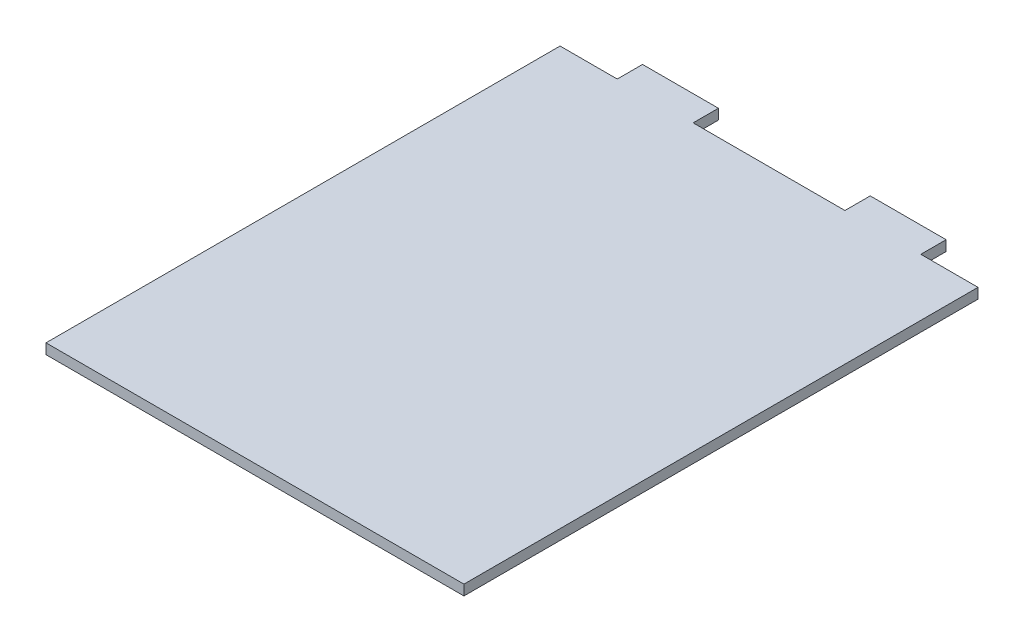
ISO-10303-21;
HEADER;
FILE_DESCRIPTION(('STEP AP214'),'2;1');
FILE_NAME('part.step','',(''),(''),'','','');
FILE_SCHEMA(('AUTOMOTIVE_DESIGN { 1 0 10303 214 1 1 1 1 }'));
ENDSEC;
DATA;
#1=APPLICATION_CONTEXT('core data for automotive mechanical design processes');
#2=APPLICATION_PROTOCOL_DEFINITION('international standard','automotive_design',2000,#1);
#3=PRODUCT_CONTEXT('',#1,'mechanical');
#4=PRODUCT('Part','Part','',(#3));
#5=PRODUCT_RELATED_PRODUCT_CATEGORY('part','',(#4));
#6=PRODUCT_DEFINITION_FORMATION('','',#4);
#7=PRODUCT_DEFINITION_CONTEXT('part definition',#1,'design');
#8=PRODUCT_DEFINITION('design','',#6,#7);
#9=PRODUCT_DEFINITION_SHAPE('','',#8);
#10=(LENGTH_UNIT() NAMED_UNIT(*) SI_UNIT(.MILLI.,.METRE.));
#11=(NAMED_UNIT(*) PLANE_ANGLE_UNIT() SI_UNIT($,.RADIAN.));
#12=(NAMED_UNIT(*) SI_UNIT($,.STERADIAN.) SOLID_ANGLE_UNIT());
#13=UNCERTAINTY_MEASURE_WITH_UNIT(LENGTH_MEASURE(1.E-05),#10,'distance_accuracy_value','');
#14=(GEOMETRIC_REPRESENTATION_CONTEXT(3) GLOBAL_UNCERTAINTY_ASSIGNED_CONTEXT((#13)) GLOBAL_UNIT_ASSIGNED_CONTEXT((#10,
#11,#12)) REPRESENTATION_CONTEXT('',''));
#15=CARTESIAN_POINT('',(0.,0.,0.));
#16=DIRECTION('',(0.,0.,1.));
#17=DIRECTION('',(1.,0.,0.));
#18=AXIS2_PLACEMENT_3D('',#15,#16,#17);
#19=CARTESIAN_POINT('',(150.,10.16,-254.));
#20=DIRECTION('',(0.,0.,1.));
#21=DIRECTION('',(1.,0.,0.));
#22=AXIS2_PLACEMENT_3D('',#19,#20,#21);
#23=PLANE('',#22);
#24=DIRECTION('',(-1.,0.,0.));
#25=VECTOR('',#24,1.);
#26=CARTESIAN_POINT('',(150.,0.,-254.));
#27=LINE('',#26,#25);
#28=CARTESIAN_POINT('',(206.5,0.,-254.));
#29=VERTEX_POINT('',#28);
#30=CARTESIAN_POINT('',(150.,0.,-254.));
#31=VERTEX_POINT('',#30);
#32=EDGE_CURVE('E157',#29,#31,#27,.T.);
#33=ORIENTED_EDGE('',*,*,#32,.T.);
#34=DIRECTION('',(0.,-1.,0.));
#35=VECTOR('',#34,1.);
#36=CARTESIAN_POINT('',(150.,10.16,-254.));
#37=LINE('',#36,#35);
#38=CARTESIAN_POINT('',(150.,10.16,-254.));
#39=VERTEX_POINT('',#38);
#40=EDGE_CURVE('E11',#39,#31,#37,.T.);
#41=ORIENTED_EDGE('',*,*,#40,.F.);
#42=DIRECTION('',(-1.,0.,0.));
#43=VECTOR('',#42,1.);
#44=CARTESIAN_POINT('',(150.,10.16,-254.));
#45=LINE('',#44,#43);
#46=CARTESIAN_POINT('',(206.5,10.16,-254.));
#47=VERTEX_POINT('',#46);
#48=EDGE_CURVE('E179',#47,#39,#45,.T.);
#49=ORIENTED_EDGE('',*,*,#48,.F.);
#50=DIRECTION('',(0.,-1.,0.));
#51=VECTOR('',#50,1.);
#52=CARTESIAN_POINT('',(206.5,10.16,-254.));
#53=LINE('',#52,#51);
#54=EDGE_CURVE('E153',#47,#29,#53,.T.);
#55=ORIENTED_EDGE('',*,*,#54,.T.);
#56=EDGE_LOOP('',(#33,#41,#49,#55));
#57=FACE_BOUND('',#56,.T.);
#58=ADVANCED_FACE('F37',(#57),#23,.F.);
#59=CARTESIAN_POINT('',(150.,10.16,-254.));
#60=DIRECTION('',(-1.,0.,0.));
#61=DIRECTION('',(0.,0.,1.));
#62=AXIS2_PLACEMENT_3D('',#59,#60,#61);
#63=PLANE('',#62);
#64=DIRECTION('',(0.,0.,-1.));
#65=VECTOR('',#64,1.);
#66=CARTESIAN_POINT('',(150.,0.,-254.));
#67=LINE('',#66,#65);
#68=CARTESIAN_POINT('',(150.,0.,-279.));
#69=VERTEX_POINT('',#68);
#70=EDGE_CURVE('E160',#31,#69,#67,.T.);
#71=ORIENTED_EDGE('',*,*,#70,.T.);
#72=DIRECTION('',(0.,-1.,0.));
#73=VECTOR('',#72,1.);
#74=CARTESIAN_POINT('',(150.,10.16,-279.));
#75=LINE('',#74,#73);
#76=CARTESIAN_POINT('',(150.,10.16,-279.));
#77=VERTEX_POINT('',#76);
#78=EDGE_CURVE('E45',#77,#69,#75,.T.);
#79=ORIENTED_EDGE('',*,*,#78,.F.);
#80=DIRECTION('',(0.,0.,-1.));
#81=VECTOR('',#80,1.);
#82=CARTESIAN_POINT('',(150.,10.16,-254.));
#83=LINE('',#82,#81);
#84=EDGE_CURVE('E108',#39,#77,#83,.T.);
#85=ORIENTED_EDGE('',*,*,#84,.F.);
#86=ORIENTED_EDGE('',*,*,#40,.T.);
#87=EDGE_LOOP('',(#71,#79,#85,#86));
#88=FACE_BOUND('',#87,.T.);
#89=ADVANCED_FACE('F257',(#88),#63,.F.);
#90=CARTESIAN_POINT('',(150.,10.16,-279.));
#91=DIRECTION('',(0.,0.,1.));
#92=DIRECTION('',(1.,0.,0.));
#93=AXIS2_PLACEMENT_3D('',#90,#91,#92);
#94=PLANE('',#93);
#95=DIRECTION('',(-1.,0.,0.));
#96=VECTOR('',#95,1.);
#97=CARTESIAN_POINT('',(150.,0.,-279.));
#98=LINE('',#97,#96);
#99=CARTESIAN_POINT('',(75.,0.,-279.));
#100=VERTEX_POINT('',#99);
#101=EDGE_CURVE('E162',#69,#100,#98,.T.);
#102=ORIENTED_EDGE('',*,*,#101,.T.);
#103=DIRECTION('',(0.,-1.,0.));
#104=VECTOR('',#103,1.);
#105=CARTESIAN_POINT('',(75.,10.16,-279.));
#106=LINE('',#105,#104);
#107=CARTESIAN_POINT('',(75.,10.16,-279.));
#108=VERTEX_POINT('',#107);
#109=EDGE_CURVE('E198',#108,#100,#106,.T.);
#110=ORIENTED_EDGE('',*,*,#109,.F.);
#111=DIRECTION('',(-1.,0.,0.));
#112=VECTOR('',#111,1.);
#113=CARTESIAN_POINT('',(150.,10.16,-279.));
#114=LINE('',#113,#112);
#115=EDGE_CURVE('E206',#77,#108,#114,.T.);
#116=ORIENTED_EDGE('',*,*,#115,.F.);
#117=ORIENTED_EDGE('',*,*,#78,.T.);
#118=EDGE_LOOP('',(#102,#110,#116,#117));
#119=FACE_BOUND('',#118,.T.);
#120=ADVANCED_FACE('F204',(#119),#94,.F.);
#121=CARTESIAN_POINT('',(75.,10.16,-279.));
#122=DIRECTION('',(1.,0.,0.));
#123=DIRECTION('',(0.,0.,-1.));
#124=AXIS2_PLACEMENT_3D('',#121,#122,#123);
#125=PLANE('',#124);
#126=DIRECTION('',(0.,0.,1.));
#127=VECTOR('',#126,1.);
#128=CARTESIAN_POINT('',(75.,0.,-279.));
#129=LINE('',#128,#127);
#130=CARTESIAN_POINT('',(75.,0.,-254.));
#131=VERTEX_POINT('',#130);
#132=EDGE_CURVE('E164',#100,#131,#129,.T.);
#133=ORIENTED_EDGE('',*,*,#132,.T.);
#134=DIRECTION('',(0.,-1.,0.));
#135=VECTOR('',#134,1.);
#136=CARTESIAN_POINT('',(75.,10.16,-254.));
#137=LINE('',#136,#135);
#138=CARTESIAN_POINT('',(75.,10.16,-254.));
#139=VERTEX_POINT('',#138);
#140=EDGE_CURVE('E195',#139,#131,#137,.T.);
#141=ORIENTED_EDGE('',*,*,#140,.F.);
#142=DIRECTION('',(0.,0.,1.));
#143=VECTOR('',#142,1.);
#144=CARTESIAN_POINT('',(75.,10.16,-279.));
#145=LINE('',#144,#143);
#146=EDGE_CURVE('E224',#108,#139,#145,.T.);
#147=ORIENTED_EDGE('',*,*,#146,.F.);
#148=ORIENTED_EDGE('',*,*,#109,.T.);
#149=EDGE_LOOP('',(#133,#141,#147,#148));
#150=FACE_BOUND('',#149,.T.);
#151=ADVANCED_FACE('F215',(#150),#125,.F.);
#152=CARTESIAN_POINT('',(-75.,10.16,-254.));
#153=DIRECTION('',(0.,0.,1.));
#154=DIRECTION('',(1.,0.,0.));
#155=AXIS2_PLACEMENT_3D('',#152,#153,#154);
#156=PLANE('',#155);
#157=DIRECTION('',(-1.,0.,0.));
#158=VECTOR('',#157,1.);
#159=CARTESIAN_POINT('',(-75.,0.,-254.));
#160=LINE('',#159,#158);
#161=CARTESIAN_POINT('',(-75.,0.,-254.));
#162=VERTEX_POINT('',#161);
#163=EDGE_CURVE('E166',#131,#162,#160,.T.);
#164=ORIENTED_EDGE('',*,*,#163,.T.);
#165=DIRECTION('',(0.,-1.,0.));
#166=VECTOR('',#165,1.);
#167=CARTESIAN_POINT('',(-75.,10.16,-254.));
#168=LINE('',#167,#166);
#169=CARTESIAN_POINT('',(-75.,10.16,-254.));
#170=VERTEX_POINT('',#169);
#171=EDGE_CURVE('E192',#170,#162,#168,.T.);
#172=ORIENTED_EDGE('',*,*,#171,.F.);
#173=DIRECTION('',(-1.,0.,0.));
#174=VECTOR('',#173,1.);
#175=CARTESIAN_POINT('',(-75.,10.16,-254.));
#176=LINE('',#175,#174);
#177=EDGE_CURVE('E221',#139,#170,#176,.T.);
#178=ORIENTED_EDGE('',*,*,#177,.F.);
#179=ORIENTED_EDGE('',*,*,#140,.T.);
#180=EDGE_LOOP('',(#164,#172,#178,#179));
#181=FACE_BOUND('',#180,.T.);
#182=ADVANCED_FACE('F219',(#181),#156,.F.);
#183=CARTESIAN_POINT('',(-75.0000000000001,10.16,-279.));
#184=DIRECTION('',(-1.,0.,0.));
#185=DIRECTION('',(0.,0.,1.));
#186=AXIS2_PLACEMENT_3D('',#183,#184,#185);
#187=PLANE('',#186);
#188=DIRECTION('',(0.,0.,-1.));
#189=VECTOR('',#188,1.);
#190=CARTESIAN_POINT('',(-75.0000000000001,0.,-279.));
#191=LINE('',#190,#189);
#192=CARTESIAN_POINT('',(-75.0000000000001,0.,-279.));
#193=VERTEX_POINT('',#192);
#194=EDGE_CURVE('E168',#162,#193,#191,.T.);
#195=ORIENTED_EDGE('',*,*,#194,.T.);
#196=DIRECTION('',(0.,-1.,0.));
#197=VECTOR('',#196,1.);
#198=CARTESIAN_POINT('',(-75.0000000000001,10.16,-279.));
#199=LINE('',#198,#197);
#200=CARTESIAN_POINT('',(-75.0000000000001,10.16,-279.));
#201=VERTEX_POINT('',#200);
#202=EDGE_CURVE('E189',#201,#193,#199,.T.);
#203=ORIENTED_EDGE('',*,*,#202,.F.);
#204=DIRECTION('',(0.,0.,-1.));
#205=VECTOR('',#204,1.);
#206=CARTESIAN_POINT('',(-75.0000000000001,10.16,-279.));
#207=LINE('',#206,#205);
#208=EDGE_CURVE('E223',#170,#201,#207,.T.);
#209=ORIENTED_EDGE('',*,*,#208,.F.);
#210=ORIENTED_EDGE('',*,*,#171,.T.);
#211=EDGE_LOOP('',(#195,#203,#209,#210));
#212=FACE_BOUND('',#211,.T.);
#213=ADVANCED_FACE('F270',(#212),#187,.F.);
#214=CARTESIAN_POINT('',(-150.,10.16,-279.));
#215=DIRECTION('',(0.,0.,1.));
#216=DIRECTION('',(1.,0.,0.));
#217=AXIS2_PLACEMENT_3D('',#214,#215,#216);
#218=PLANE('',#217);
#219=DIRECTION('',(-1.,0.,0.));
#220=VECTOR('',#219,1.);
#221=CARTESIAN_POINT('',(-150.,0.,-279.));
#222=LINE('',#221,#220);
#223=CARTESIAN_POINT('',(-150.,0.,-279.));
#224=VERTEX_POINT('',#223);
#225=EDGE_CURVE('E170',#193,#224,#222,.T.);
#226=ORIENTED_EDGE('',*,*,#225,.T.);
#227=DIRECTION('',(0.,-1.,0.));
#228=VECTOR('',#227,1.);
#229=CARTESIAN_POINT('',(-150.,10.16,-279.));
#230=LINE('',#229,#228);
#231=CARTESIAN_POINT('',(-150.,10.16,-279.));
#232=VERTEX_POINT('',#231);
#233=EDGE_CURVE('E186',#232,#224,#230,.T.);
#234=ORIENTED_EDGE('',*,*,#233,.F.);
#235=DIRECTION('',(-1.,0.,0.));
#236=VECTOR('',#235,1.);
#237=CARTESIAN_POINT('',(-150.,10.16,-279.));
#238=LINE('',#237,#236);
#239=EDGE_CURVE('E226',#201,#232,#238,.T.);
#240=ORIENTED_EDGE('',*,*,#239,.F.);
#241=ORIENTED_EDGE('',*,*,#202,.T.);
#242=EDGE_LOOP('',(#226,#234,#240,#241));
#243=FACE_BOUND('',#242,.T.);
#244=ADVANCED_FACE('F273',(#243),#218,.F.);
#245=CARTESIAN_POINT('',(-150.,10.16,-254.));
#246=DIRECTION('',(1.,0.,0.));
#247=DIRECTION('',(0.,0.,-1.));
#248=AXIS2_PLACEMENT_3D('',#245,#246,#247);
#249=PLANE('',#248);
#250=DIRECTION('',(0.,0.,1.));
#251=VECTOR('',#250,1.);
#252=CARTESIAN_POINT('',(-150.,0.,-254.));
#253=LINE('',#252,#251);
#254=CARTESIAN_POINT('',(-150.,0.,-254.));
#255=VERTEX_POINT('',#254);
#256=EDGE_CURVE('E172',#224,#255,#253,.T.);
#257=ORIENTED_EDGE('',*,*,#256,.T.);
#258=DIRECTION('',(0.,-1.,0.));
#259=VECTOR('',#258,1.);
#260=CARTESIAN_POINT('',(-150.,10.16,-254.));
#261=LINE('',#260,#259);
#262=CARTESIAN_POINT('',(-150.,10.16,-254.));
#263=VERTEX_POINT('',#262);
#264=EDGE_CURVE('E183',#263,#255,#261,.T.);
#265=ORIENTED_EDGE('',*,*,#264,.F.);
#266=DIRECTION('',(0.,0.,1.));
#267=VECTOR('',#266,1.);
#268=CARTESIAN_POINT('',(-150.,10.16,-254.));
#269=LINE('',#268,#267);
#270=EDGE_CURVE('E232',#232,#263,#269,.T.);
#271=ORIENTED_EDGE('',*,*,#270,.F.);
#272=ORIENTED_EDGE('',*,*,#233,.T.);
#273=EDGE_LOOP('',(#257,#265,#271,#272));
#274=FACE_BOUND('',#273,.T.);
#275=ADVANCED_FACE('F238',(#274),#249,.F.);
#276=CARTESIAN_POINT('',(-206.5,10.16,-254.));
#277=DIRECTION('',(0.,0.,1.));
#278=DIRECTION('',(1.,0.,0.));
#279=AXIS2_PLACEMENT_3D('',#276,#277,#278);
#280=PLANE('',#279);
#281=DIRECTION('',(-1.,0.,0.));
#282=VECTOR('',#281,1.);
#283=CARTESIAN_POINT('',(-206.5,0.,-254.));
#284=LINE('',#283,#282);
#285=CARTESIAN_POINT('',(-206.5,0.,-254.));
#286=VERTEX_POINT('',#285);
#287=EDGE_CURVE('E174',#255,#286,#284,.T.);
#288=ORIENTED_EDGE('',*,*,#287,.T.);
#289=DIRECTION('',(0.,-1.,0.));
#290=VECTOR('',#289,1.);
#291=CARTESIAN_POINT('',(-206.5,10.16,-254.));
#292=LINE('',#291,#290);
#293=CARTESIAN_POINT('',(-206.5,10.16,-254.));
#294=VERTEX_POINT('',#293);
#295=EDGE_CURVE('E148',#294,#286,#292,.T.);
#296=ORIENTED_EDGE('',*,*,#295,.F.);
#297=DIRECTION('',(-1.,0.,0.));
#298=VECTOR('',#297,1.);
#299=CARTESIAN_POINT('',(-206.5,10.16,-254.));
#300=LINE('',#299,#298);
#301=EDGE_CURVE('E139',#263,#294,#300,.T.);
#302=ORIENTED_EDGE('',*,*,#301,.F.);
#303=ORIENTED_EDGE('',*,*,#264,.T.);
#304=EDGE_LOOP('',(#288,#296,#302,#303));
#305=FACE_BOUND('',#304,.T.);
#306=ADVANCED_FACE('F242',(#305),#280,.F.);
#307=CARTESIAN_POINT('',(-206.5,10.16,254.));
#308=DIRECTION('',(1.,0.,0.));
#309=DIRECTION('',(0.,0.,-1.));
#310=AXIS2_PLACEMENT_3D('',#307,#308,#309);
#311=PLANE('',#310);
#312=DIRECTION('',(0.,0.,1.));
#313=VECTOR('',#312,1.);
#314=CARTESIAN_POINT('',(-206.5,0.,254.));
#315=LINE('',#314,#313);
#316=CARTESIAN_POINT('',(-206.5,0.,254.));
#317=VERTEX_POINT('',#316);
#318=EDGE_CURVE('E147',#286,#317,#315,.T.);
#319=ORIENTED_EDGE('',*,*,#318,.T.);
#320=DIRECTION('',(0.,-1.,0.));
#321=VECTOR('',#320,1.);
#322=CARTESIAN_POINT('',(-206.5,10.16,254.));
#323=LINE('',#322,#321);
#324=CARTESIAN_POINT('',(-206.5,10.16,254.));
#325=VERTEX_POINT('',#324);
#326=EDGE_CURVE('E144',#325,#317,#323,.T.);
#327=ORIENTED_EDGE('',*,*,#326,.F.);
#328=DIRECTION('',(0.,0.,1.));
#329=VECTOR('',#328,1.);
#330=CARTESIAN_POINT('',(-206.5,10.16,254.));
#331=LINE('',#330,#329);
#332=EDGE_CURVE('E133',#294,#325,#331,.T.);
#333=ORIENTED_EDGE('',*,*,#332,.F.);
#334=ORIENTED_EDGE('',*,*,#295,.T.);
#335=EDGE_LOOP('',(#319,#327,#333,#334));
#336=FACE_BOUND('',#335,.T.);
#337=ADVANCED_FACE('F145',(#336),#311,.F.);
#338=CARTESIAN_POINT('',(-206.5,10.16,254.));
#339=DIRECTION('',(0.,0.,-1.));
#340=DIRECTION('',(-1.,0.,0.));
#341=AXIS2_PLACEMENT_3D('',#338,#339,#340);
#342=PLANE('',#341);
#343=DIRECTION('',(1.,0.,0.));
#344=VECTOR('',#343,1.);
#345=CARTESIAN_POINT('',(-206.5,0.,254.));
#346=LINE('',#345,#344);
#347=CARTESIAN_POINT('',(206.5,0.,254.));
#348=VERTEX_POINT('',#347);
#349=EDGE_CURVE('E94',#317,#348,#346,.T.);
#350=ORIENTED_EDGE('',*,*,#349,.T.);
#351=DIRECTION('',(0.,-1.,0.));
#352=VECTOR('',#351,1.);
#353=CARTESIAN_POINT('',(206.5,10.16,254.));
#354=LINE('',#353,#352);
#355=CARTESIAN_POINT('',(206.5,10.16,254.));
#356=VERTEX_POINT('',#355);
#357=EDGE_CURVE('E149',#356,#348,#354,.T.);
#358=ORIENTED_EDGE('',*,*,#357,.F.);
#359=DIRECTION('',(1.,0.,0.));
#360=VECTOR('',#359,1.);
#361=CARTESIAN_POINT('',(-206.5,10.16,254.));
#362=LINE('',#361,#360);
#363=EDGE_CURVE('E137',#325,#356,#362,.T.);
#364=ORIENTED_EDGE('',*,*,#363,.F.);
#365=ORIENTED_EDGE('',*,*,#326,.T.);
#366=EDGE_LOOP('',(#350,#358,#364,#365));
#367=FACE_BOUND('',#366,.T.);
#368=ADVANCED_FACE('F151',(#367),#342,.F.);
#369=CARTESIAN_POINT('',(206.5,10.16,254.));
#370=DIRECTION('',(-1.,0.,0.));
#371=DIRECTION('',(0.,0.,1.));
#372=AXIS2_PLACEMENT_3D('',#369,#370,#371);
#373=PLANE('',#372);
#374=DIRECTION('',(0.,0.,-1.));
#375=VECTOR('',#374,1.);
#376=CARTESIAN_POINT('',(206.5,0.,254.));
#377=LINE('',#376,#375);
#378=EDGE_CURVE('E100',#348,#29,#377,.T.);
#379=ORIENTED_EDGE('',*,*,#378,.T.);
#380=ORIENTED_EDGE('',*,*,#54,.F.);
#381=DIRECTION('',(0.,0.,-1.));
#382=VECTOR('',#381,1.);
#383=CARTESIAN_POINT('',(206.5,10.16,254.));
#384=LINE('',#383,#382);
#385=EDGE_CURVE('E53',#356,#47,#384,.T.);
#386=ORIENTED_EDGE('',*,*,#385,.F.);
#387=ORIENTED_EDGE('',*,*,#357,.T.);
#388=EDGE_LOOP('',(#379,#380,#386,#387));
#389=FACE_BOUND('',#388,.T.);
#390=ADVANCED_FACE('F246',(#389),#373,.F.);
#391=CARTESIAN_POINT('',(0.,10.16,0.));
#392=DIRECTION('',(0.,1.,0.));
#393=DIRECTION('',(0.,0.,1.));
#394=AXIS2_PLACEMENT_3D('',#391,#392,#393);
#395=PLANE('',#394);
#396=ORIENTED_EDGE('',*,*,#48,.T.);
#397=ORIENTED_EDGE('',*,*,#84,.T.);
#398=ORIENTED_EDGE('',*,*,#115,.T.);
#399=ORIENTED_EDGE('',*,*,#146,.T.);
#400=ORIENTED_EDGE('',*,*,#177,.T.);
#401=ORIENTED_EDGE('',*,*,#208,.T.);
#402=ORIENTED_EDGE('',*,*,#239,.T.);
#403=ORIENTED_EDGE('',*,*,#270,.T.);
#404=ORIENTED_EDGE('',*,*,#301,.T.);
#405=ORIENTED_EDGE('',*,*,#332,.T.);
#406=ORIENTED_EDGE('',*,*,#363,.T.);
#407=ORIENTED_EDGE('',*,*,#385,.T.);
#408=EDGE_LOOP('',(#396,#397,#398,#399,#400,#401,#402,#403,#404,#405,#406,#407));
#409=FACE_BOUND('',#408,.T.);
#410=ADVANCED_FACE('F135',(#409),#395,.T.);
#411=CARTESIAN_POINT('',(0.,0.,0.));
#412=DIRECTION('',(0.,1.,0.));
#413=DIRECTION('',(0.,0.,1.));
#414=AXIS2_PLACEMENT_3D('',#411,#412,#413);
#415=PLANE('',#414);
#416=ORIENTED_EDGE('',*,*,#32,.F.);
#417=ORIENTED_EDGE('',*,*,#378,.F.);
#418=ORIENTED_EDGE('',*,*,#349,.F.);
#419=ORIENTED_EDGE('',*,*,#318,.F.);
#420=ORIENTED_EDGE('',*,*,#287,.F.);
#421=ORIENTED_EDGE('',*,*,#256,.F.);
#422=ORIENTED_EDGE('',*,*,#225,.F.);
#423=ORIENTED_EDGE('',*,*,#194,.F.);
#424=ORIENTED_EDGE('',*,*,#163,.F.);
#425=ORIENTED_EDGE('',*,*,#132,.F.);
#426=ORIENTED_EDGE('',*,*,#101,.F.);
#427=ORIENTED_EDGE('',*,*,#70,.F.);
#428=EDGE_LOOP('',(#416,#417,#418,#419,#420,#421,#422,#423,#424,#425,#426,#427));
#429=FACE_BOUND('',#428,.T.);
#430=ADVANCED_FACE('F210',(#429),#415,.F.);
#431=CLOSED_SHELL('',(#58,#89,#120,#151,#182,#213,#244,#275,#306,#337,#368,#390,#410,#430));
#432=MANIFOLD_SOLID_BREP('B2',#431);
#433=ADVANCED_BREP_SHAPE_REPRESENTATION('',(#18,#432),#14);
#434=SHAPE_DEFINITION_REPRESENTATION(#9,#433);
ENDSEC;
END-ISO-10303-21;
